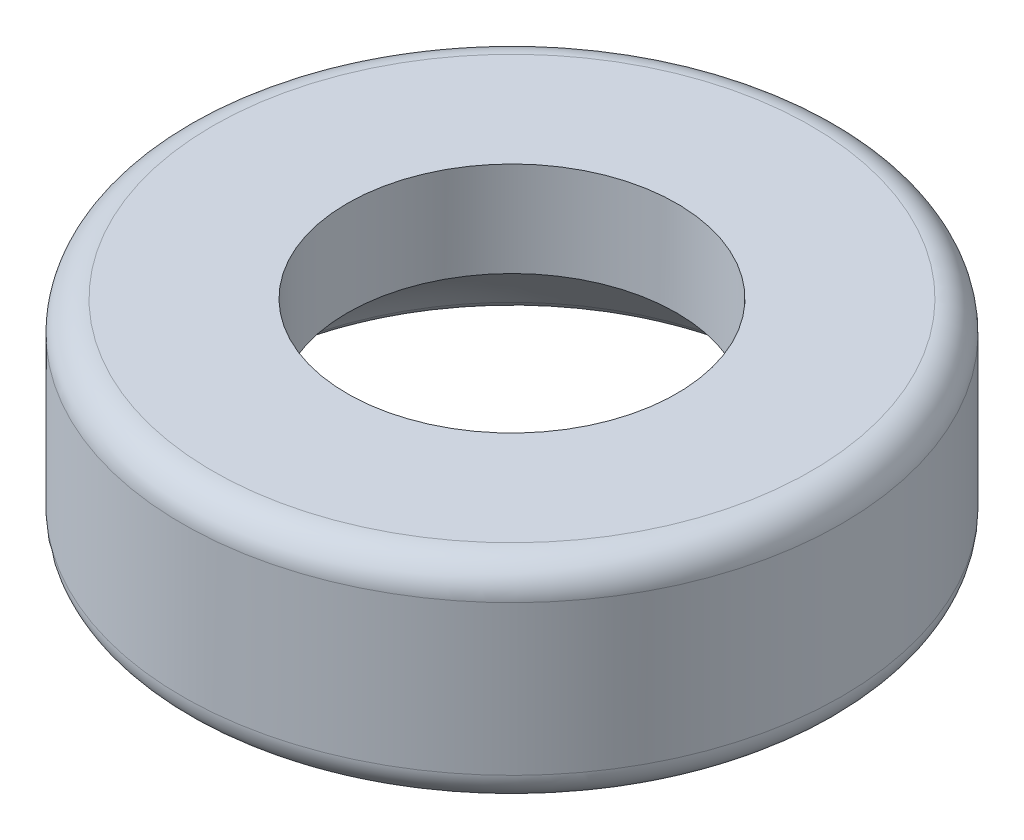
ISO-10303-21;
HEADER;
FILE_DESCRIPTION(('STEP AP214'),'2;1');
FILE_NAME('part.step','',(''),(''),'','','');
FILE_SCHEMA(('AUTOMOTIVE_DESIGN { 1 0 10303 214 1 1 1 1 }'));
ENDSEC;
DATA;
#1=APPLICATION_CONTEXT('core data for automotive mechanical design processes');
#2=APPLICATION_PROTOCOL_DEFINITION('international standard','automotive_design',2000,#1);
#3=PRODUCT_CONTEXT('',#1,'mechanical');
#4=PRODUCT('Part','Part','',(#3));
#5=PRODUCT_RELATED_PRODUCT_CATEGORY('part','',(#4));
#6=PRODUCT_DEFINITION_FORMATION('','',#4);
#7=PRODUCT_DEFINITION_CONTEXT('part definition',#1,'design');
#8=PRODUCT_DEFINITION('design','',#6,#7);
#9=PRODUCT_DEFINITION_SHAPE('','',#8);
#10=(LENGTH_UNIT() NAMED_UNIT(*) SI_UNIT(.MILLI.,.METRE.));
#11=(NAMED_UNIT(*) PLANE_ANGLE_UNIT() SI_UNIT($,.RADIAN.));
#12=(NAMED_UNIT(*) SI_UNIT($,.STERADIAN.) SOLID_ANGLE_UNIT());
#13=UNCERTAINTY_MEASURE_WITH_UNIT(LENGTH_MEASURE(1.E-05),#10,'distance_accuracy_value','');
#14=(GEOMETRIC_REPRESENTATION_CONTEXT(3) GLOBAL_UNCERTAINTY_ASSIGNED_CONTEXT((#13)) GLOBAL_UNIT_ASSIGNED_CONTEXT((#10,
#11,#12)) REPRESENTATION_CONTEXT('',''));
#15=CARTESIAN_POINT('',(0.,0.,0.));
#16=DIRECTION('',(0.,0.,1.));
#17=DIRECTION('',(1.,0.,0.));
#18=AXIS2_PLACEMENT_3D('',#15,#16,#17);
#19=CARTESIAN_POINT('',(0.,0.,0.));
#20=DIRECTION('',(0.,-1.,0.));
#21=DIRECTION('',(1.,0.,0.));
#22=AXIS2_PLACEMENT_3D('',#19,#20,#21);
#23=SPHERICAL_SURFACE('',#22,4.1275);
#24=CARTESIAN_POINT('',(0.,3.57451985412028,0.));
#25=DIRECTION('',(0.,-1.,0.));
#26=DIRECTION('',(1.,0.,0.));
#27=AXIS2_PLACEMENT_3D('',#24,#25,#26);
#28=CIRCLE('',#27,2.06375);
#29=CARTESIAN_POINT('',(2.06374999999998,3.57451985412029,0.));
#30=VERTEX_POINT('',#29);
#31=EDGE_CURVE('E61',#30,#30,#28,.T.);
#32=CARTESIAN_POINT('',(0.,2.29610123616728,0.));
#33=DIRECTION('',(0.,-1.,0.));
#34=DIRECTION('',(1.,0.,0.));
#35=AXIS2_PLACEMENT_3D('',#32,#33,#34);
#36=CIRCLE('',#35,3.42989436619718);
#37=CARTESIAN_POINT('',(3.42989436619716,2.29610123616729,0.));
#38=VERTEX_POINT('',#37);
#39=EDGE_CURVE('E56',#38,#38,#36,.T.);
#40=CARTESIAN_POINT('',(2.06374999999998,3.57451985412029,0.));
#41=CARTESIAN_POINT('',(2.08077659253798,3.5646895582289,0.));
#42=CARTESIAN_POINT('',(2.09773293738674,3.55473759028056,0.));
#43=CARTESIAN_POINT('',(2.13150169240705,3.53459238131429,0.));
#44=CARTESIAN_POINT('',(2.1483141025786,3.52439914029635,0.));
#45=CARTESIAN_POINT('',(2.18179154894573,3.50377345623521,0.));
#46=CARTESIAN_POINT('',(2.19845658514132,3.493341013192,0.));
#47=CARTESIAN_POINT('',(2.2316358822269,3.47223905817087,0.));
#48=CARTESIAN_POINT('',(2.2481501431169,3.46156954619294,0.));
#49=CARTESIAN_POINT('',(2.28102451693973,3.43999563126506,0.));
#50=CARTESIAN_POINT('',(2.29738462987257,3.4290912283151,0.));
#51=CARTESIAN_POINT('',(2.32994736717187,3.40704975831828,0.));
#52=CARTESIAN_POINT('',(2.34614999153834,3.39591269127141,0.));
#53=CARTESIAN_POINT('',(2.37839444310332,3.37340816721185,0.));
#54=CARTESIAN_POINT('',(2.39443627030183,3.36204071019916,0.));
#55=CARTESIAN_POINT('',(2.42635585180461,3.33907772745261,0.));
#56=CARTESIAN_POINT('',(2.44223360610888,3.32748220171877,0.));
#57=CARTESIAN_POINT('',(2.47382179958963,3.3040654493279,0.));
#58=CARTESIAN_POINT('',(2.48953223876611,3.29224422267088,0.));
#59=CARTESIAN_POINT('',(2.52078259392635,3.26837848232458,0.));
#60=CARTESIAN_POINT('',(2.5363225099101,3.2563339686353,0.));
#61=CARTESIAN_POINT('',(2.56722864543993,3.23202411370921,0.));
#62=CARTESIAN_POINT('',(2.58259486498601,3.21975877247239,0.));
#63=CARTESIAN_POINT('',(2.61315046986449,3.1950097670292,0.));
#64=CARTESIAN_POINT('',(2.62833985519688,3.18252610282282,0.));
#65=CARTESIAN_POINT('',(2.65853868998142,3.15734300059985,0.));
#66=CARTESIAN_POINT('',(2.67354813943357,3.14464356258325,0.));
#67=CARTESIAN_POINT('',(2.70338403753387,3.11903150596015,0.));
#68=CARTESIAN_POINT('',(2.71821048618203,3.10611888735364,0.));
#69=CARTESIAN_POINT('',(2.74767735511933,3.0800831063024,0.));
#70=CARTESIAN_POINT('',(2.76231777540847,3.06695994385766,0.));
#71=CARTESIAN_POINT('',(2.79140959805962,3.04050575487461,0.));
#72=CARTESIAN_POINT('',(2.80586100042163,3.0271747283363,0.));
#73=CARTESIAN_POINT('',(2.83457183624777,3.00030753335653,0.));
#74=CARTESIAN_POINT('',(2.84883126971191,2.98677136491507,0.));
#75=CARTESIAN_POINT('',(2.87715525597156,2.95949665020933,0.));
#76=CARTESIAN_POINT('',(2.89121980876707,2.94575810394504,0.));
#77=CARTESIAN_POINT('',(2.91915116171327,2.91808143899944,0.));
#78=CARTESIAN_POINT('',(2.93301796186396,2.90414332031812,0.));
#79=CARTESIAN_POINT('',(2.96055097792533,2.87607035669685,0.));
#80=CARTESIAN_POINT('',(2.97421719383601,2.8619355117569,0.));
#81=CARTESIAN_POINT('',(3.00134625078139,2.8334719819482,0.));
#82=CARTESIAN_POINT('',(3.01480909181609,2.81914329707944,0.));
#83=CARTESIAN_POINT('',(3.04152864990264,2.79029501332501,0.));
#84=CARTESIAN_POINT('',(3.05478536695449,2.77577541443933,0.));
#85=CARTESIAN_POINT('',(3.08108997005881,2.74654826754744,0.));
#86=CARTESIAN_POINT('',(3.09413785611128,2.73184071954122,0.));
#87=CARTESIAN_POINT('',(3.12002213284386,2.70224067768399,0.));
#88=CARTESIAN_POINT('',(3.13285852352396,2.68734818383299,0.));
#89=CARTESIAN_POINT('',(3.15831718832485,2.65738129132696,0.));
#90=CARTESIAN_POINT('',(3.17093946244563,2.64230689267192,0.));
#91=CARTESIAN_POINT('',(3.19596731666811,2.61197926874671,0.));
#92=CARTESIAN_POINT('',(3.2083728967698,2.59672604347654,0.));
#93=CARTESIAN_POINT('',(3.23296482972569,2.56604388101417,0.));
#94=CARTESIAN_POINT('',(3.24515118257989,2.55061494382199,0.));
#95=CARTESIAN_POINT('',(3.26930217264372,2.51958450813409,0.));
#96=CARTESIAN_POINT('',(3.28126680985336,2.50398300963836,0.));
#97=CARTESIAN_POINT('',(3.30497192526186,2.4726106370308,0.));
#98=CARTESIAN_POINT('',(3.31671240346073,2.45683976291895,0.));
#99=CARTESIAN_POINT('',(3.33996680416296,2.42513185997997,0.));
#100=CARTESIAN_POINT('',(3.35148072666632,2.40919483115284,0.));
#101=CARTESIAN_POINT('',(3.3742796621657,2.37715787127289,0.));
#102=CARTESIAN_POINT('',(3.38556467516171,2.36105794022007,0.));
#103=CARTESIAN_POINT('',(3.40790349722818,2.32869847037584,0.));
#104=CARTESIAN_POINT('',(3.41895730629862,2.31243893158443,0.));
#105=CARTESIAN_POINT('',(3.42989436619716,2.29610123616729,0.));
#106=B_SPLINE_CURVE_WITH_KNOTS('',3,(#40,#41,#42,#43,#44,#45,#46,#47,#48,#49,#50,#51,#52,#53,
#54,#55,#56,#57,#58,#59,#60,#61,#62,#63,#64,#65,#66,#67,#68,#69,#70,#71,#72,#73,#74,#75,#76,#77,
#78,#79,#80,#81,#82,#83,#84,#85,#86,#87,#88,#89,#90,#91,#92,#93,#94,#95,#96,#97,#98,#99,#100,
#101,#102,#103,#104,#105),.UNSPECIFIED.,.F.,.F.,(4,2,2,2,2,2,2,2,2,2,2,2,2,2,2,2,2,2,2,2,2,2,2,
2,2,2,2,2,2,2,2,2,4),(0.,0.0589813265991741,0.117962653198348,0.176943979797522,
0.235925306396695,0.29490663299587,0.353887959595044,0.412869286194218,0.471850612793392,
0.530831939392565,0.589813265991739,0.648794592590914,0.707775919190087,0.766757245789262,
0.825738572388435,0.884719898987609,0.943701225586783,1.00268255218596,1.06166387878513,
1.1206452053843,1.17962653198348,1.23860785858265,1.29758918518183,1.356570511781,
1.41555183838017,1.47453316497935,1.53351449157852,1.5924958181777,1.65147714477687,
1.71045847137604,1.76943979797522,1.82842112457439,1.88740245117357),.UNSPECIFIED.);
#107=EDGE_CURVE('BSEAM41',#30,#38,#106,.T.);
#108=ORIENTED_EDGE('',*,*,#31,.F.);
#109=ORIENTED_EDGE('',*,*,#39,.T.);
#110=ORIENTED_EDGE('',*,*,#107,.T.);
#111=ORIENTED_EDGE('',*,*,#107,.F.);
#112=EDGE_LOOP('',(#108,#110,#109,#111));
#113=FACE_BOUND('',#112,.T.);
#114=ADVANCED_FACE('F41',(#113),#23,.F.);
#115=CARTESIAN_POINT('',(4.12749999999999,4.76250000000015,0.));
#116=DIRECTION('',(0.,1.,0.));
#117=DIRECTION('',(-1.,0.,0.));
#118=AXIS2_PLACEMENT_3D('',#115,#116,#117);
#119=PLANE('',#118);
#120=CARTESIAN_POINT('',(0.,4.76250000000013,0.));
#121=DIRECTION('',(0.,1.,0.));
#122=DIRECTION('',(-1.,0.,0.));
#123=AXIS2_PLACEMENT_3D('',#120,#121,#122);
#124=CIRCLE('',#123,2.06375);
#125=CARTESIAN_POINT('',(-2.06375000000002,4.76250000000013,0.));
#126=VERTEX_POINT('',#125);
#127=EDGE_CURVE('E64',#126,#126,#124,.T.);
#128=ORIENTED_EDGE('',*,*,#127,.F.);
#129=EDGE_LOOP('',(#128));
#130=FACE_BOUND('',#129,.T.);
#131=CARTESIAN_POINT('',(0.,4.76250000000013,0.));
#132=DIRECTION('',(0.,1.,0.));
#133=DIRECTION('',(-1.,0.,0.));
#134=AXIS2_PLACEMENT_3D('',#131,#132,#133);
#135=CIRCLE('',#134,3.7465);
#136=CARTESIAN_POINT('',(-3.74650000000001,4.76250000000012,0.));
#137=VERTEX_POINT('',#136);
#138=EDGE_CURVE('E10',#137,#137,#135,.T.);
#139=ORIENTED_EDGE('',*,*,#138,.T.);
#140=EDGE_LOOP('',(#139));
#141=FACE_BOUND('',#140,.T.);
#142=ADVANCED_FACE('F70',(#130,#141),#119,.T.);
#143=CARTESIAN_POINT('',(3.11906922694238E-13,-90.9283619922498,0.));
#144=DIRECTION('',(0.,-1.,0.));
#145=DIRECTION('',(1.,0.,0.));
#146=AXIS2_PLACEMENT_3D('',#143,#144,#145);
#147=CYLINDRICAL_SURFACE('',#146,4.1275);
#148=CARTESIAN_POINT('',(0.,2.50804904258273,0.));
#149=DIRECTION('',(0.,-1.,0.));
#150=DIRECTION('',(1.,0.,0.));
#151=AXIS2_PLACEMENT_3D('',#148,#149,#150);
#152=CIRCLE('',#151,4.1275);
#153=CARTESIAN_POINT('',(4.12749999999999,2.50804904258274,0.));
#154=VERTEX_POINT('',#153);
#155=EDGE_CURVE('E48',#154,#154,#152,.F.);
#156=ORIENTED_EDGE('',*,*,#155,.T.);
#157=EDGE_LOOP('',(#156));
#158=FACE_BOUND('',#157,.T.);
#159=CARTESIAN_POINT('',(0.,4.38150000000013,0.));
#160=DIRECTION('',(0.,1.,0.));
#161=DIRECTION('',(-1.,0.,0.));
#162=AXIS2_PLACEMENT_3D('',#159,#160,#161);
#163=CIRCLE('',#162,4.1275);
#164=CARTESIAN_POINT('',(-4.12750000000001,4.38150000000012,0.));
#165=VERTEX_POINT('',#164);
#166=EDGE_CURVE('E52',#165,#165,#163,.F.);
#167=ORIENTED_EDGE('',*,*,#166,.T.);
#168=EDGE_LOOP('',(#167));
#169=FACE_BOUND('',#168,.T.);
#170=ADVANCED_FACE('F72',(#158,#169),#147,.T.);
#171=CARTESIAN_POINT('',(0.,2.50804904258272,0.));
#172=DIRECTION('',(0.,-1.,0.));
#173=DIRECTION('',(1.,0.,0.));
#174=AXIS2_PLACEMENT_3D('',#171,#172,#173);
#175=TOROIDAL_SURFACE('',#174,3.7465,0.381);
#176=ORIENTED_EDGE('',*,*,#155,.F.);
#177=EDGE_LOOP('',(#176));
#178=FACE_BOUND('',#177,.T.);
#179=ORIENTED_EDGE('',*,*,#39,.F.);
#180=EDGE_LOOP('',(#179));
#181=FACE_BOUND('',#180,.T.);
#182=ADVANCED_FACE('F79',(#178,#181),#175,.T.);
#183=CARTESIAN_POINT('',(0.,4.38150000000013,0.));
#184=DIRECTION('',(0.,1.,0.));
#185=DIRECTION('',(-1.,0.,0.));
#186=AXIS2_PLACEMENT_3D('',#183,#184,#185);
#187=TOROIDAL_SURFACE('',#186,3.7465,0.381);
#188=ORIENTED_EDGE('',*,*,#138,.F.);
#189=EDGE_LOOP('',(#188));
#190=FACE_BOUND('',#189,.T.);
#191=ORIENTED_EDGE('',*,*,#166,.F.);
#192=EDGE_LOOP('',(#191));
#193=FACE_BOUND('',#192,.T.);
#194=ADVANCED_FACE('F43',(#190,#193),#187,.T.);
#195=CARTESIAN_POINT('',(0.,2.12704904258271,0.));
#196=DIRECTION('',(0.,1.,0.));
#197=DIRECTION('',(-1.,0.,0.));
#198=AXIS2_PLACEMENT_3D('',#195,#196,#197);
#199=CYLINDRICAL_SURFACE('',#198,2.06375);
#200=ORIENTED_EDGE('',*,*,#31,.T.);
#201=EDGE_LOOP('',(#200));
#202=FACE_BOUND('',#201,.T.);
#203=ORIENTED_EDGE('',*,*,#127,.T.);
#204=EDGE_LOOP('',(#203));
#205=FACE_BOUND('',#204,.T.);
#206=ADVANCED_FACE('F68',(#202,#205),#199,.F.);
#207=CLOSED_SHELL('',(#114,#142,#170,#182,#194,#206));
#208=MANIFOLD_SOLID_BREP('B2',#207);
#209=ADVANCED_BREP_SHAPE_REPRESENTATION('',(#18,#208),#14);
#210=SHAPE_DEFINITION_REPRESENTATION(#9,#209);
ENDSEC;
END-ISO-10303-21;
